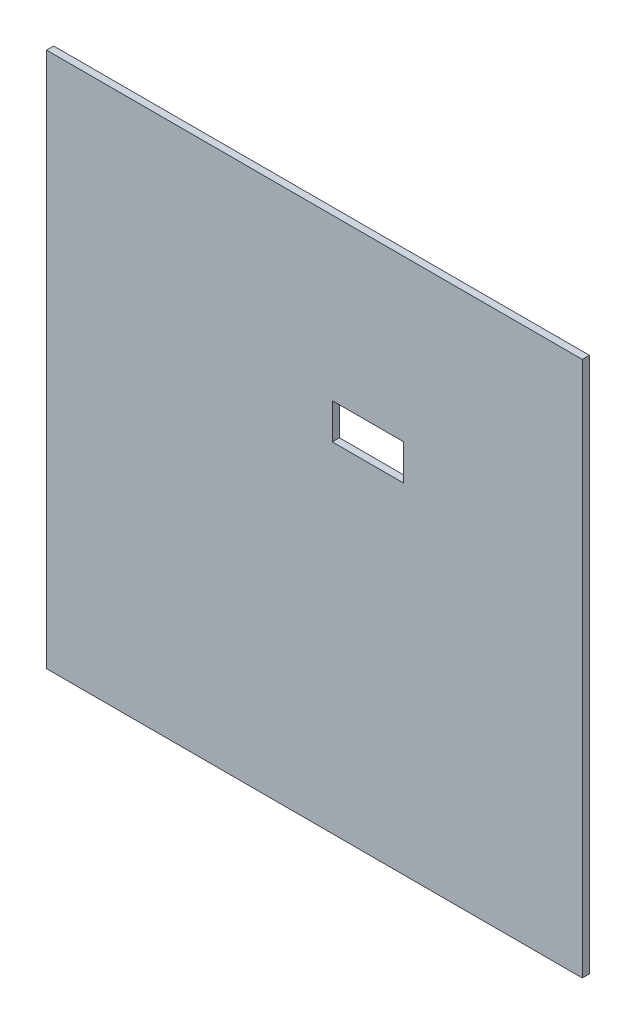
ISO-10303-21;
HEADER;
FILE_DESCRIPTION(('STEP AP214'),'2;1');
FILE_NAME('part.step','',(''),(''),'','','');
FILE_SCHEMA(('AUTOMOTIVE_DESIGN { 1 0 10303 214 1 1 1 1 }'));
ENDSEC;
DATA;
#1=APPLICATION_CONTEXT('core data for automotive mechanical design processes');
#2=APPLICATION_PROTOCOL_DEFINITION('international standard','automotive_design',2000,#1);
#3=PRODUCT_CONTEXT('',#1,'mechanical');
#4=PRODUCT('Part','Part','',(#3));
#5=PRODUCT_RELATED_PRODUCT_CATEGORY('part','',(#4));
#6=PRODUCT_DEFINITION_FORMATION('','',#4);
#7=PRODUCT_DEFINITION_CONTEXT('part definition',#1,'design');
#8=PRODUCT_DEFINITION('design','',#6,#7);
#9=PRODUCT_DEFINITION_SHAPE('','',#8);
#10=(LENGTH_UNIT() NAMED_UNIT(*) SI_UNIT(.MILLI.,.METRE.));
#11=(NAMED_UNIT(*) PLANE_ANGLE_UNIT() SI_UNIT($,.RADIAN.));
#12=(NAMED_UNIT(*) SI_UNIT($,.STERADIAN.) SOLID_ANGLE_UNIT());
#13=UNCERTAINTY_MEASURE_WITH_UNIT(LENGTH_MEASURE(1.E-05),#10,'distance_accuracy_value','');
#14=(GEOMETRIC_REPRESENTATION_CONTEXT(3) GLOBAL_UNCERTAINTY_ASSIGNED_CONTEXT((#13)) GLOBAL_UNIT_ASSIGNED_CONTEXT((#10,
#11,#12)) REPRESENTATION_CONTEXT('',''));
#15=CARTESIAN_POINT('',(0.,0.,0.));
#16=DIRECTION('',(0.,0.,1.));
#17=DIRECTION('',(1.,0.,0.));
#18=AXIS2_PLACEMENT_3D('',#15,#16,#17);
#19=CARTESIAN_POINT('',(-5000.,5000.,200.));
#20=DIRECTION('',(1.,0.,0.));
#21=DIRECTION('',(0.,1.,0.));
#22=AXIS2_PLACEMENT_3D('',#19,#20,#21);
#23=PLANE('',#22);
#24=DIRECTION('',(0.,-1.,0.));
#25=VECTOR('',#24,1.);
#26=CARTESIAN_POINT('',(-5000.,5000.,0.));
#27=LINE('',#26,#25);
#28=CARTESIAN_POINT('',(-5000.,5000.,0.));
#29=VERTEX_POINT('',#28);
#30=CARTESIAN_POINT('',(-5000.,-10000.,0.));
#31=VERTEX_POINT('',#30);
#32=EDGE_CURVE('E151',#29,#31,#27,.T.);
#33=ORIENTED_EDGE('',*,*,#32,.T.);
#34=DIRECTION('',(0.,0.,-1.));
#35=VECTOR('',#34,1.);
#36=CARTESIAN_POINT('',(-5000.,-10000.,200.));
#37=LINE('',#36,#35);
#38=CARTESIAN_POINT('',(-5000.,-10000.,200.));
#39=VERTEX_POINT('',#38);
#40=EDGE_CURVE('E11',#39,#31,#37,.T.);
#41=ORIENTED_EDGE('',*,*,#40,.F.);
#42=DIRECTION('',(0.,-1.,0.));
#43=VECTOR('',#42,1.);
#44=CARTESIAN_POINT('',(-5000.,5000.,200.));
#45=LINE('',#44,#43);
#46=CARTESIAN_POINT('',(-5000.,5000.,200.));
#47=VERTEX_POINT('',#46);
#48=EDGE_CURVE('E157',#47,#39,#45,.T.);
#49=ORIENTED_EDGE('',*,*,#48,.F.);
#50=DIRECTION('',(0.,0.,-1.));
#51=VECTOR('',#50,1.);
#52=CARTESIAN_POINT('',(-5000.,5000.,200.));
#53=LINE('',#52,#51);
#54=EDGE_CURVE('E171',#47,#29,#53,.T.);
#55=ORIENTED_EDGE('',*,*,#54,.T.);
#56=EDGE_LOOP('',(#33,#41,#49,#55));
#57=FACE_BOUND('',#56,.T.);
#58=ADVANCED_FACE('F43',(#57),#23,.F.);
#59=CARTESIAN_POINT('',(-5000.,-10000.,200.));
#60=DIRECTION('',(0.,1.,0.));
#61=DIRECTION('',(0.,0.,1.));
#62=AXIS2_PLACEMENT_3D('',#59,#60,#61);
#63=PLANE('',#62);
#64=DIRECTION('',(1.,0.,0.));
#65=VECTOR('',#64,1.);
#66=CARTESIAN_POINT('',(-5000.,-10000.,0.));
#67=LINE('',#66,#65);
#68=CARTESIAN_POINT('',(10000.,-10000.,0.));
#69=VERTEX_POINT('',#68);
#70=EDGE_CURVE('E175',#31,#69,#67,.T.);
#71=ORIENTED_EDGE('',*,*,#70,.T.);
#72=DIRECTION('',(0.,0.,-1.));
#73=VECTOR('',#72,1.);
#74=CARTESIAN_POINT('',(10000.,-10000.,200.));
#75=LINE('',#74,#73);
#76=CARTESIAN_POINT('',(10000.,-10000.,200.));
#77=VERTEX_POINT('',#76);
#78=EDGE_CURVE('E51',#77,#69,#75,.T.);
#79=ORIENTED_EDGE('',*,*,#78,.F.);
#80=DIRECTION('',(1.,0.,0.));
#81=VECTOR('',#80,1.);
#82=CARTESIAN_POINT('',(-5000.,-10000.,200.));
#83=LINE('',#82,#81);
#84=EDGE_CURVE('E161',#39,#77,#83,.T.);
#85=ORIENTED_EDGE('',*,*,#84,.F.);
#86=ORIENTED_EDGE('',*,*,#40,.T.);
#87=EDGE_LOOP('',(#71,#79,#85,#86));
#88=FACE_BOUND('',#87,.T.);
#89=ADVANCED_FACE('F209',(#88),#63,.F.);
#90=CARTESIAN_POINT('',(10000.,5000.,200.));
#91=DIRECTION('',(-1.,0.,0.));
#92=DIRECTION('',(0.,-1.,0.));
#93=AXIS2_PLACEMENT_3D('',#90,#91,#92);
#94=PLANE('',#93);
#95=DIRECTION('',(0.,1.,0.));
#96=VECTOR('',#95,1.);
#97=CARTESIAN_POINT('',(10000.,5000.,0.));
#98=LINE('',#97,#96);
#99=CARTESIAN_POINT('',(10000.,5000.,0.));
#100=VERTEX_POINT('',#99);
#101=EDGE_CURVE('E178',#69,#100,#98,.T.);
#102=ORIENTED_EDGE('',*,*,#101,.T.);
#103=DIRECTION('',(0.,0.,-1.));
#104=VECTOR('',#103,1.);
#105=CARTESIAN_POINT('',(10000.,5000.,200.));
#106=LINE('',#105,#104);
#107=CARTESIAN_POINT('',(10000.,5000.,200.));
#108=VERTEX_POINT('',#107);
#109=EDGE_CURVE('E186',#108,#100,#106,.T.);
#110=ORIENTED_EDGE('',*,*,#109,.F.);
#111=DIRECTION('',(0.,1.,0.));
#112=VECTOR('',#111,1.);
#113=CARTESIAN_POINT('',(10000.,5000.,200.));
#114=LINE('',#113,#112);
#115=EDGE_CURVE('E165',#77,#108,#114,.T.);
#116=ORIENTED_EDGE('',*,*,#115,.F.);
#117=ORIENTED_EDGE('',*,*,#78,.T.);
#118=EDGE_LOOP('',(#102,#110,#116,#117));
#119=FACE_BOUND('',#118,.T.);
#120=ADVANCED_FACE('F195',(#119),#94,.F.);
#121=CARTESIAN_POINT('',(-5000.,5000.,200.));
#122=DIRECTION('',(0.,-1.,0.));
#123=DIRECTION('',(0.,0.,-1.));
#124=AXIS2_PLACEMENT_3D('',#121,#122,#123);
#125=PLANE('',#124);
#126=DIRECTION('',(-1.,0.,0.));
#127=VECTOR('',#126,1.);
#128=CARTESIAN_POINT('',(-5000.,5000.,0.));
#129=LINE('',#128,#127);
#130=EDGE_CURVE('E162',#100,#29,#129,.T.);
#131=ORIENTED_EDGE('',*,*,#130,.T.);
#132=ORIENTED_EDGE('',*,*,#54,.F.);
#133=DIRECTION('',(-1.,0.,0.));
#134=VECTOR('',#133,1.);
#135=CARTESIAN_POINT('',(-5000.,5000.,200.));
#136=LINE('',#135,#134);
#137=EDGE_CURVE('E168',#108,#47,#136,.T.);
#138=ORIENTED_EDGE('',*,*,#137,.F.);
#139=ORIENTED_EDGE('',*,*,#109,.T.);
#140=EDGE_LOOP('',(#131,#132,#138,#139));
#141=FACE_BOUND('',#140,.T.);
#142=ADVANCED_FACE('F202',(#141),#125,.F.);
#143=CARTESIAN_POINT('',(0.,0.,200.));
#144=DIRECTION('',(0.,0.,1.));
#145=DIRECTION('',(1.,0.,0.));
#146=AXIS2_PLACEMENT_3D('',#143,#144,#145);
#147=PLANE('',#146);
#148=DIRECTION('',(0.,-1.,0.));
#149=VECTOR('',#148,1.);
#150=CARTESIAN_POINT('',(3000.,500.,200.));
#151=LINE('',#150,#149);
#152=CARTESIAN_POINT('',(3000.,500.,200.));
#153=VERTEX_POINT('',#152);
#154=CARTESIAN_POINT('',(3000.,-500.,200.));
#155=VERTEX_POINT('',#154);
#156=EDGE_CURVE('E58',#153,#155,#151,.T.);
#157=ORIENTED_EDGE('',*,*,#156,.F.);
#158=DIRECTION('',(-1.,0.,0.));
#159=VECTOR('',#158,1.);
#160=CARTESIAN_POINT('',(3000.,500.,200.));
#161=LINE('',#160,#159);
#162=CARTESIAN_POINT('',(5000.,500.,200.));
#163=VERTEX_POINT('',#162);
#164=EDGE_CURVE('E129',#163,#153,#161,.T.);
#165=ORIENTED_EDGE('',*,*,#164,.F.);
#166=DIRECTION('',(0.,1.,0.));
#167=VECTOR('',#166,1.);
#168=CARTESIAN_POINT('',(5000.,500.,200.));
#169=LINE('',#168,#167);
#170=CARTESIAN_POINT('',(5000.,-499.999999999999,200.));
#171=VERTEX_POINT('',#170);
#172=EDGE_CURVE('E133',#171,#163,#169,.T.);
#173=ORIENTED_EDGE('',*,*,#172,.F.);
#174=DIRECTION('',(1.,0.,0.));
#175=VECTOR('',#174,1.);
#176=CARTESIAN_POINT('',(3000.,-500.,200.));
#177=LINE('',#176,#175);
#178=EDGE_CURVE('E142',#155,#171,#177,.T.);
#179=ORIENTED_EDGE('',*,*,#178,.F.);
#180=EDGE_LOOP('',(#157,#165,#173,#179));
#181=FACE_BOUND('',#180,.T.);
#182=ORIENTED_EDGE('',*,*,#48,.T.);
#183=ORIENTED_EDGE('',*,*,#84,.T.);
#184=ORIENTED_EDGE('',*,*,#115,.T.);
#185=ORIENTED_EDGE('',*,*,#137,.T.);
#186=EDGE_LOOP('',(#182,#183,#184,#185));
#187=FACE_BOUND('',#186,.T.);
#188=ADVANCED_FACE('F208',(#181,#187),#147,.T.);
#189=CARTESIAN_POINT('',(0.,0.,0.));
#190=DIRECTION('',(0.,0.,1.));
#191=DIRECTION('',(1.,0.,0.));
#192=AXIS2_PLACEMENT_3D('',#189,#190,#191);
#193=PLANE('',#192);
#194=DIRECTION('',(-1.,0.,0.));
#195=VECTOR('',#194,1.);
#196=CARTESIAN_POINT('',(3000.,500.,0.));
#197=LINE('',#196,#195);
#198=CARTESIAN_POINT('',(5000.,500.,0.));
#199=VERTEX_POINT('',#198);
#200=CARTESIAN_POINT('',(3000.,500.,0.));
#201=VERTEX_POINT('',#200);
#202=EDGE_CURVE('E117',#199,#201,#197,.T.);
#203=ORIENTED_EDGE('',*,*,#202,.T.);
#204=DIRECTION('',(0.,-1.,0.));
#205=VECTOR('',#204,1.);
#206=CARTESIAN_POINT('',(3000.,500.,0.));
#207=LINE('',#206,#205);
#208=CARTESIAN_POINT('',(3000.,-500.,0.));
#209=VERTEX_POINT('',#208);
#210=EDGE_CURVE('E110',#201,#209,#207,.T.);
#211=ORIENTED_EDGE('',*,*,#210,.T.);
#212=DIRECTION('',(1.,0.,0.));
#213=VECTOR('',#212,1.);
#214=CARTESIAN_POINT('',(3000.,-500.,0.));
#215=LINE('',#214,#213);
#216=CARTESIAN_POINT('',(5000.,-499.999999999999,0.));
#217=VERTEX_POINT('',#216);
#218=EDGE_CURVE('E120',#209,#217,#215,.T.);
#219=ORIENTED_EDGE('',*,*,#218,.T.);
#220=DIRECTION('',(0.,1.,0.));
#221=VECTOR('',#220,1.);
#222=CARTESIAN_POINT('',(5000.,500.,0.));
#223=LINE('',#222,#221);
#224=EDGE_CURVE('E66',#217,#199,#223,.T.);
#225=ORIENTED_EDGE('',*,*,#224,.T.);
#226=EDGE_LOOP('',(#203,#211,#219,#225));
#227=FACE_BOUND('',#226,.T.);
#228=ORIENTED_EDGE('',*,*,#32,.F.);
#229=ORIENTED_EDGE('',*,*,#130,.F.);
#230=ORIENTED_EDGE('',*,*,#101,.F.);
#231=ORIENTED_EDGE('',*,*,#70,.F.);
#232=EDGE_LOOP('',(#228,#229,#230,#231));
#233=FACE_BOUND('',#232,.T.);
#234=ADVANCED_FACE('F125',(#227,#233),#193,.F.);
#235=CARTESIAN_POINT('',(3000.,500.,0.));
#236=DIRECTION('',(-1.,0.,0.));
#237=DIRECTION('',(0.,0.,1.));
#238=AXIS2_PLACEMENT_3D('',#235,#236,#237);
#239=PLANE('',#238);
#240=ORIENTED_EDGE('',*,*,#156,.T.);
#241=DIRECTION('',(0.,0.,1.));
#242=VECTOR('',#241,1.);
#243=CARTESIAN_POINT('',(3000.,-500.,0.));
#244=LINE('',#243,#242);
#245=EDGE_CURVE('E106',#209,#155,#244,.T.);
#246=ORIENTED_EDGE('',*,*,#245,.F.);
#247=ORIENTED_EDGE('',*,*,#210,.F.);
#248=DIRECTION('',(0.,0.,1.));
#249=VECTOR('',#248,1.);
#250=CARTESIAN_POINT('',(3000.,500.,0.));
#251=LINE('',#250,#249);
#252=EDGE_CURVE('E148',#201,#153,#251,.T.);
#253=ORIENTED_EDGE('',*,*,#252,.T.);
#254=EDGE_LOOP('',(#240,#246,#247,#253));
#255=FACE_BOUND('',#254,.T.);
#256=ADVANCED_FACE('F108',(#255),#239,.F.);
#257=CARTESIAN_POINT('',(3000.,500.,0.));
#258=DIRECTION('',(0.,1.,0.));
#259=DIRECTION('',(-1.,0.,0.));
#260=AXIS2_PLACEMENT_3D('',#257,#258,#259);
#261=PLANE('',#260);
#262=ORIENTED_EDGE('',*,*,#164,.T.);
#263=ORIENTED_EDGE('',*,*,#252,.F.);
#264=ORIENTED_EDGE('',*,*,#202,.F.);
#265=DIRECTION('',(0.,0.,1.));
#266=VECTOR('',#265,1.);
#267=CARTESIAN_POINT('',(5000.,500.,0.));
#268=LINE('',#267,#266);
#269=EDGE_CURVE('E152',#199,#163,#268,.T.);
#270=ORIENTED_EDGE('',*,*,#269,.T.);
#271=EDGE_LOOP('',(#262,#263,#264,#270));
#272=FACE_BOUND('',#271,.T.);
#273=ADVANCED_FACE('F226',(#272),#261,.F.);
#274=CARTESIAN_POINT('',(5000.,500.,0.));
#275=DIRECTION('',(1.,0.,0.));
#276=DIRECTION('',(0.,0.,-1.));
#277=AXIS2_PLACEMENT_3D('',#274,#275,#276);
#278=PLANE('',#277);
#279=ORIENTED_EDGE('',*,*,#172,.T.);
#280=ORIENTED_EDGE('',*,*,#269,.F.);
#281=ORIENTED_EDGE('',*,*,#224,.F.);
#282=DIRECTION('',(0.,0.,1.));
#283=VECTOR('',#282,1.);
#284=CARTESIAN_POINT('',(5000.,-499.999999999999,0.));
#285=LINE('',#284,#283);
#286=EDGE_CURVE('E116',#217,#171,#285,.T.);
#287=ORIENTED_EDGE('',*,*,#286,.T.);
#288=EDGE_LOOP('',(#279,#280,#281,#287));
#289=FACE_BOUND('',#288,.T.);
#290=ADVANCED_FACE('F229',(#289),#278,.F.);
#291=CARTESIAN_POINT('',(3000.,-500.,0.));
#292=DIRECTION('',(0.,-1.,0.));
#293=DIRECTION('',(1.,0.,0.));
#294=AXIS2_PLACEMENT_3D('',#291,#292,#293);
#295=PLANE('',#294);
#296=ORIENTED_EDGE('',*,*,#178,.T.);
#297=ORIENTED_EDGE('',*,*,#286,.F.);
#298=ORIENTED_EDGE('',*,*,#218,.F.);
#299=ORIENTED_EDGE('',*,*,#245,.T.);
#300=EDGE_LOOP('',(#296,#297,#298,#299));
#301=FACE_BOUND('',#300,.T.);
#302=ADVANCED_FACE('F121',(#301),#295,.F.);
#303=CLOSED_SHELL('',(#58,#89,#120,#142,#188,#234,#256,#273,#290,#302));
#304=MANIFOLD_SOLID_BREP('B2',#303);
#305=ADVANCED_BREP_SHAPE_REPRESENTATION('',(#18,#304),#14);
#306=SHAPE_DEFINITION_REPRESENTATION(#9,#305);
ENDSEC;
END-ISO-10303-21;
